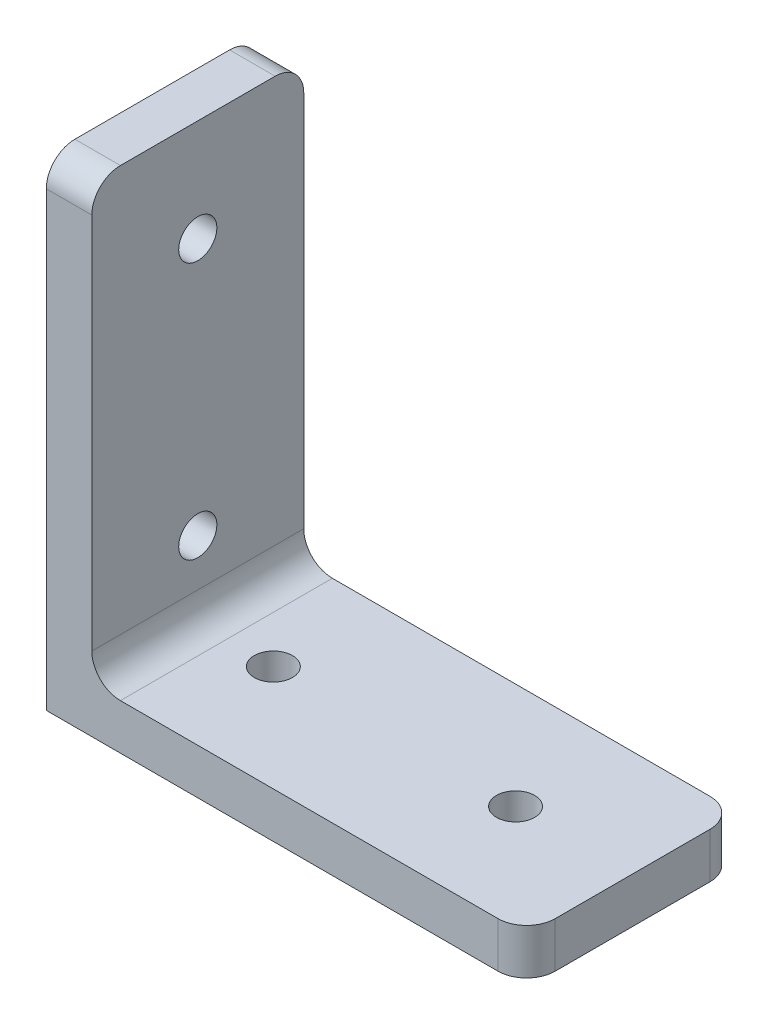
ISO-10303-21;
HEADER;
FILE_DESCRIPTION(('STEP AP214'),'2;1');
FILE_NAME('part.step','',(''),(''),'','','');
FILE_SCHEMA(('AUTOMOTIVE_DESIGN { 1 0 10303 214 1 1 1 1 }'));
ENDSEC;
DATA;
#1=APPLICATION_CONTEXT('core data for automotive mechanical design processes');
#2=APPLICATION_PROTOCOL_DEFINITION('international standard','automotive_design',2000,#1);
#3=PRODUCT_CONTEXT('',#1,'mechanical');
#4=PRODUCT('Part','Part','',(#3));
#5=PRODUCT_RELATED_PRODUCT_CATEGORY('part','',(#4));
#6=PRODUCT_DEFINITION_FORMATION('','',#4);
#7=PRODUCT_DEFINITION_CONTEXT('part definition',#1,'design');
#8=PRODUCT_DEFINITION('design','',#6,#7);
#9=PRODUCT_DEFINITION_SHAPE('','',#8);
#10=(LENGTH_UNIT() NAMED_UNIT(*) SI_UNIT(.MILLI.,.METRE.));
#11=(NAMED_UNIT(*) PLANE_ANGLE_UNIT() SI_UNIT($,.RADIAN.));
#12=(NAMED_UNIT(*) SI_UNIT($,.STERADIAN.) SOLID_ANGLE_UNIT());
#13=UNCERTAINTY_MEASURE_WITH_UNIT(LENGTH_MEASURE(1.E-05),#10,'distance_accuracy_value','');
#14=(GEOMETRIC_REPRESENTATION_CONTEXT(3) GLOBAL_UNCERTAINTY_ASSIGNED_CONTEXT((#13)) GLOBAL_UNIT_ASSIGNED_CONTEXT((#10,
#11,#12)) REPRESENTATION_CONTEXT('',''));
#15=CARTESIAN_POINT('',(0.,0.,0.));
#16=DIRECTION('',(0.,0.,1.));
#17=DIRECTION('',(1.,0.,0.));
#18=AXIS2_PLACEMENT_3D('',#15,#16,#17);
#19=CARTESIAN_POINT('',(4.77520000000008,39.6687,0.));
#20=DIRECTION('',(-1.,0.,0.));
#21=DIRECTION('',(0.,0.,1.));
#22=AXIS2_PLACEMENT_3D('',#19,#20,#21);
#23=CYLINDRICAL_SURFACE('',#22,2.);
#24=CARTESIAN_POINT('',(4.77520000000008,39.6687,0.));
#25=DIRECTION('',(-1.,0.,0.));
#26=DIRECTION('',(0.,0.,1.));
#27=AXIS2_PLACEMENT_3D('',#24,#25,#26);
#28=CIRCLE('',#27,2.);
#29=CARTESIAN_POINT('',(4.77520000000008,39.6687,2.));
#30=VERTEX_POINT('',#29);
#31=EDGE_CURVE('E149',#30,#30,#28,.T.);
#32=ORIENTED_EDGE('',*,*,#31,.F.);
#33=EDGE_LOOP('',(#32));
#34=FACE_BOUND('',#33,.T.);
#35=CARTESIAN_POINT('',(0.,39.6687,0.));
#36=DIRECTION('',(-1.,0.,0.));
#37=DIRECTION('',(0.,0.,1.));
#38=AXIS2_PLACEMENT_3D('',#35,#36,#37);
#39=CIRCLE('',#38,2.);
#40=CARTESIAN_POINT('',(0.,39.6687,2.));
#41=VERTEX_POINT('',#40);
#42=EDGE_CURVE('E116',#41,#41,#39,.T.);
#43=ORIENTED_EDGE('',*,*,#42,.T.);
#44=EDGE_LOOP('',(#43));
#45=FACE_BOUND('',#44,.T.);
#46=ADVANCED_FACE('F17',(#34,#45),#23,.F.);
#47=CARTESIAN_POINT('',(0.,12.7,0.));
#48=DIRECTION('',(-1.,0.,0.));
#49=DIRECTION('',(0.,0.,1.));
#50=AXIS2_PLACEMENT_3D('',#47,#48,#49);
#51=CYLINDRICAL_SURFACE('',#50,1.99999999999999);
#52=CARTESIAN_POINT('',(4.77520000000002,12.7,0.));
#53=DIRECTION('',(-1.,0.,0.));
#54=DIRECTION('',(0.,0.,1.));
#55=AXIS2_PLACEMENT_3D('',#52,#53,#54);
#56=CIRCLE('',#55,1.99999999999999);
#57=CARTESIAN_POINT('',(4.77520000000002,12.7,1.99999999999999));
#58=VERTEX_POINT('',#57);
#59=EDGE_CURVE('E20',#58,#58,#56,.T.);
#60=ORIENTED_EDGE('',*,*,#59,.F.);
#61=EDGE_LOOP('',(#60));
#62=FACE_BOUND('',#61,.T.);
#63=CARTESIAN_POINT('',(0.,12.7,0.));
#64=DIRECTION('',(-1.,0.,0.));
#65=DIRECTION('',(0.,0.,1.));
#66=AXIS2_PLACEMENT_3D('',#63,#64,#65);
#67=CIRCLE('',#66,1.99999999999999);
#68=CARTESIAN_POINT('',(0.,12.7,1.99999999999999));
#69=VERTEX_POINT('',#68);
#70=EDGE_CURVE('E178',#69,#69,#67,.T.);
#71=ORIENTED_EDGE('',*,*,#70,.T.);
#72=EDGE_LOOP('',(#71));
#73=FACE_BOUND('',#72,.T.);
#74=ADVANCED_FACE('F196',(#62,#73),#51,.F.);
#75=CARTESIAN_POINT('',(0.,47.3710902043135,-8.1125));
#76=DIRECTION('',(1.,0.,0.));
#77=DIRECTION('',(0.,0.,-1.));
#78=AXIS2_PLACEMENT_3D('',#75,#76,#77);
#79=CYLINDRICAL_SURFACE('',#78,3.);
#80=CARTESIAN_POINT('',(0.,47.3710902043135,-8.1125));
#81=DIRECTION('',(1.,0.,0.));
#82=DIRECTION('',(0.,0.,-1.));
#83=AXIS2_PLACEMENT_3D('',#80,#81,#82);
#84=CIRCLE('',#83,3.);
#85=CARTESIAN_POINT('',(0.,47.3710902043135,-11.1125));
#86=VERTEX_POINT('',#85);
#87=CARTESIAN_POINT('',(0.,50.3710902043135,-8.1125));
#88=VERTEX_POINT('',#87);
#89=EDGE_CURVE('E176',#86,#88,#84,.T.);
#90=ORIENTED_EDGE('',*,*,#89,.T.);
#91=DIRECTION('',(1.,0.,0.));
#92=VECTOR('',#91,1.);
#93=CARTESIAN_POINT('',(0.,50.3710902043135,-8.1125));
#94=LINE('',#93,#92);
#95=CARTESIAN_POINT('',(4.77520000000005,50.3710902043135,-8.1125));
#96=VERTEX_POINT('',#95);
#97=EDGE_CURVE('E99',#96,#88,#94,.F.);
#98=ORIENTED_EDGE('',*,*,#97,.F.);
#99=CARTESIAN_POINT('',(4.77520000000001,47.3710902043135,-8.1125));
#100=DIRECTION('',(1.,0.,0.));
#101=DIRECTION('',(0.,0.,-1.));
#102=AXIS2_PLACEMENT_3D('',#99,#100,#101);
#103=CIRCLE('',#102,3.);
#104=CARTESIAN_POINT('',(4.77520000000001,47.3710902043135,-11.1125));
#105=VERTEX_POINT('',#104);
#106=EDGE_CURVE('E93',#105,#96,#103,.T.);
#107=ORIENTED_EDGE('',*,*,#106,.F.);
#108=DIRECTION('',(1.,0.,0.));
#109=VECTOR('',#108,1.);
#110=CARTESIAN_POINT('',(46.0248,47.3710902043135,-11.1125));
#111=LINE('',#110,#109);
#112=EDGE_CURVE('E97',#105,#86,#111,.F.);
#113=ORIENTED_EDGE('',*,*,#112,.T.);
#114=EDGE_LOOP('',(#90,#98,#107,#113));
#115=FACE_BOUND('',#114,.T.);
#116=ADVANCED_FACE('F96',(#115),#79,.T.);
#117=CARTESIAN_POINT('',(0.,50.3710902043135,0.));
#118=DIRECTION('',(0.,1.,0.));
#119=DIRECTION('',(0.,0.,1.));
#120=AXIS2_PLACEMENT_3D('',#117,#118,#119);
#121=PLANE('',#120);
#122=DIRECTION('',(0.,0.,1.));
#123=VECTOR('',#122,1.);
#124=CARTESIAN_POINT('',(4.77520000000009,50.3710902043135,11.1125));
#125=LINE('',#124,#123);
#126=CARTESIAN_POINT('',(4.77520000000005,50.3710902043135,8.1125));
#127=VERTEX_POINT('',#126);
#128=EDGE_CURVE('E104',#96,#127,#125,.T.);
#129=ORIENTED_EDGE('',*,*,#128,.F.);
#130=ORIENTED_EDGE('',*,*,#97,.T.);
#131=DIRECTION('',(0.,0.,1.));
#132=VECTOR('',#131,1.);
#133=CARTESIAN_POINT('',(0.,50.3710902043135,11.1125));
#134=LINE('',#133,#132);
#135=CARTESIAN_POINT('',(0.,50.3710902043135,8.1125));
#136=VERTEX_POINT('',#135);
#137=EDGE_CURVE('E175',#88,#136,#134,.T.);
#138=ORIENTED_EDGE('',*,*,#137,.T.);
#139=DIRECTION('',(-1.,0.,0.));
#140=VECTOR('',#139,1.);
#141=CARTESIAN_POINT('',(46.0248,50.3710902043135,8.1125));
#142=LINE('',#141,#140);
#143=EDGE_CURVE('E141',#127,#136,#142,.T.);
#144=ORIENTED_EDGE('',*,*,#143,.F.);
#145=EDGE_LOOP('',(#129,#130,#138,#144));
#146=FACE_BOUND('',#145,.T.);
#147=ADVANCED_FACE('F261',(#146),#121,.T.);
#148=CARTESIAN_POINT('',(4.77520000000007,42.8204269072704,11.1125));
#149=DIRECTION('',(1.,0.,0.));
#150=DIRECTION('',(0.,1.,0.));
#151=AXIS2_PLACEMENT_3D('',#148,#149,#150);
#152=PLANE('',#151);
#153=DIRECTION('',(0.,1.,0.));
#154=VECTOR('',#153,1.);
#155=CARTESIAN_POINT('',(4.77520000000001,2.797247396956,-11.1125));
#156=LINE('',#155,#154);
#157=CARTESIAN_POINT('',(4.77520000000001,7.7752,-11.1125));
#158=VERTEX_POINT('',#157);
#159=EDGE_CURVE('E111',#158,#105,#156,.T.);
#160=ORIENTED_EDGE('',*,*,#159,.T.);
#161=ORIENTED_EDGE('',*,*,#106,.T.);
#162=ORIENTED_EDGE('',*,*,#128,.T.);
#163=CARTESIAN_POINT('',(4.77520000000001,47.3710902043135,8.1125));
#164=DIRECTION('',(-1.,0.,0.));
#165=DIRECTION('',(0.,0.,1.));
#166=AXIS2_PLACEMENT_3D('',#163,#164,#165);
#167=CIRCLE('',#166,3.);
#168=CARTESIAN_POINT('',(4.77520000000001,47.3710902043135,11.1125));
#169=VERTEX_POINT('',#168);
#170=EDGE_CURVE('E103',#169,#127,#167,.T.);
#171=ORIENTED_EDGE('',*,*,#170,.F.);
#172=DIRECTION('',(0.,1.,0.));
#173=VECTOR('',#172,1.);
#174=CARTESIAN_POINT('',(4.77520000000001,2.797247396956,11.1125));
#175=LINE('',#174,#173);
#176=CARTESIAN_POINT('',(4.77520000000001,7.7752,11.1125));
#177=VERTEX_POINT('',#176);
#178=EDGE_CURVE('E147',#177,#169,#175,.T.);
#179=ORIENTED_EDGE('',*,*,#178,.F.);
#180=DIRECTION('',(0.,0.,-1.));
#181=VECTOR('',#180,1.);
#182=CARTESIAN_POINT('',(4.77520000000001,7.7752,11.1125));
#183=LINE('',#182,#181);
#184=EDGE_CURVE('E121',#177,#158,#183,.T.);
#185=ORIENTED_EDGE('',*,*,#184,.T.);
#186=EDGE_LOOP('',(#160,#161,#162,#171,#179,#185));
#187=FACE_BOUND('',#186,.T.);
#188=ORIENTED_EDGE('',*,*,#31,.T.);
#189=EDGE_LOOP('',(#188));
#190=FACE_BOUND('',#189,.T.);
#191=ORIENTED_EDGE('',*,*,#59,.T.);
#192=EDGE_LOOP('',(#191));
#193=FACE_BOUND('',#192,.T.);
#194=ADVANCED_FACE('F118',(#187,#190,#193),#152,.T.);
#195=CARTESIAN_POINT('',(46.0248,47.3710902043135,8.1125));
#196=DIRECTION('',(-1.,0.,0.));
#197=DIRECTION('',(0.,0.,1.));
#198=AXIS2_PLACEMENT_3D('',#195,#196,#197);
#199=CYLINDRICAL_SURFACE('',#198,3.);
#200=CARTESIAN_POINT('',(0.,47.3710902043135,8.1125));
#201=DIRECTION('',(-1.,0.,0.));
#202=DIRECTION('',(0.,0.,1.));
#203=AXIS2_PLACEMENT_3D('',#200,#201,#202);
#204=CIRCLE('',#203,3.);
#205=CARTESIAN_POINT('',(0.,47.3710902043135,11.1125));
#206=VERTEX_POINT('',#205);
#207=EDGE_CURVE('E172',#136,#206,#204,.F.);
#208=ORIENTED_EDGE('',*,*,#207,.T.);
#209=DIRECTION('',(1.,0.,0.));
#210=VECTOR('',#209,1.);
#211=CARTESIAN_POINT('',(46.0248,47.3710902043135,11.1125));
#212=LINE('',#211,#210);
#213=EDGE_CURVE('E144',#169,#206,#212,.F.);
#214=ORIENTED_EDGE('',*,*,#213,.F.);
#215=ORIENTED_EDGE('',*,*,#170,.T.);
#216=ORIENTED_EDGE('',*,*,#143,.T.);
#217=EDGE_LOOP('',(#208,#214,#215,#216));
#218=FACE_BOUND('',#217,.T.);
#219=ADVANCED_FACE('F254',(#218),#199,.T.);
#220=CARTESIAN_POINT('',(7.77520000000001,7.7752,11.1125));
#221=DIRECTION('',(0.,0.,-1.));
#222=DIRECTION('',(-1.,0.,0.));
#223=AXIS2_PLACEMENT_3D('',#220,#221,#222);
#224=CYLINDRICAL_SURFACE('',#223,3.);
#225=ORIENTED_EDGE('',*,*,#184,.F.);
#226=CARTESIAN_POINT('',(7.77520000000001,7.7752,11.1125));
#227=DIRECTION('',(0.,0.,-1.));
#228=DIRECTION('',(-1.,0.,0.));
#229=AXIS2_PLACEMENT_3D('',#226,#227,#228);
#230=CIRCLE('',#229,3.);
#231=CARTESIAN_POINT('',(7.77520000000001,4.7752,11.1125));
#232=VERTEX_POINT('',#231);
#233=EDGE_CURVE('E168',#232,#177,#230,.T.);
#234=ORIENTED_EDGE('',*,*,#233,.F.);
#235=DIRECTION('',(0.,0.,1.));
#236=VECTOR('',#235,1.);
#237=CARTESIAN_POINT('',(7.77520000000001,4.7752,11.1125));
#238=LINE('',#237,#236);
#239=CARTESIAN_POINT('',(7.77520000000001,4.7752,-11.1125));
#240=VERTEX_POINT('',#239);
#241=EDGE_CURVE('E140',#240,#232,#238,.T.);
#242=ORIENTED_EDGE('',*,*,#241,.F.);
#243=CARTESIAN_POINT('',(7.77520000000001,7.7752,-11.1125));
#244=DIRECTION('',(0.,0.,-1.));
#245=DIRECTION('',(-1.,0.,0.));
#246=AXIS2_PLACEMENT_3D('',#243,#244,#245);
#247=CIRCLE('',#246,3.);
#248=EDGE_CURVE('E122',#240,#158,#247,.T.);
#249=ORIENTED_EDGE('',*,*,#248,.T.);
#250=EDGE_LOOP('',(#225,#234,#242,#249));
#251=FACE_BOUND('',#250,.T.);
#252=ADVANCED_FACE('F250',(#251),#224,.F.);
#253=CARTESIAN_POINT('',(5.28320000000001,4.7752,11.1125));
#254=DIRECTION('',(0.,1.,0.));
#255=DIRECTION('',(-1.,0.,0.));
#256=AXIS2_PLACEMENT_3D('',#253,#254,#255);
#257=PLANE('',#256);
#258=CARTESIAN_POINT('',(12.7,4.7752,0.));
#259=DIRECTION('',(0.,-1.,0.));
#260=DIRECTION('',(0.,0.,-1.));
#261=AXIS2_PLACEMENT_3D('',#258,#259,#260);
#262=CIRCLE('',#261,1.99999999999999);
#263=CARTESIAN_POINT('',(12.7,4.7752,-1.99999999999999));
#264=VERTEX_POINT('',#263);
#265=EDGE_CURVE('E143',#264,#264,#262,.T.);
#266=ORIENTED_EDGE('',*,*,#265,.T.);
#267=EDGE_LOOP('',(#266));
#268=FACE_BOUND('',#267,.T.);
#269=CARTESIAN_POINT('',(38.1,4.7752,0.));
#270=DIRECTION('',(0.,-1.,0.));
#271=DIRECTION('',(0.,0.,-1.));
#272=AXIS2_PLACEMENT_3D('',#269,#270,#271);
#273=CIRCLE('',#272,2.);
#274=CARTESIAN_POINT('',(38.1,4.7752,-2.));
#275=VERTEX_POINT('',#274);
#276=EDGE_CURVE('E184',#275,#275,#273,.T.);
#277=ORIENTED_EDGE('',*,*,#276,.T.);
#278=EDGE_LOOP('',(#277));
#279=FACE_BOUND('',#278,.T.);
#280=DIRECTION('',(1.,0.,0.));
#281=VECTOR('',#280,1.);
#282=CARTESIAN_POINT('',(46.0248,4.7752,-11.1125));
#283=LINE('',#282,#281);
#284=CARTESIAN_POINT('',(47.3710902043135,4.7752,-11.1125));
#285=VERTEX_POINT('',#284);
#286=EDGE_CURVE('E124',#285,#240,#283,.F.);
#287=ORIENTED_EDGE('',*,*,#286,.T.);
#288=ORIENTED_EDGE('',*,*,#241,.T.);
#289=DIRECTION('',(1.,0.,0.));
#290=VECTOR('',#289,1.);
#291=CARTESIAN_POINT('',(46.0248,4.7752,11.1125));
#292=LINE('',#291,#290);
#293=CARTESIAN_POINT('',(47.3710902043135,4.7752,11.1125));
#294=VERTEX_POINT('',#293);
#295=EDGE_CURVE('E171',#294,#232,#292,.F.);
#296=ORIENTED_EDGE('',*,*,#295,.F.);
#297=CARTESIAN_POINT('',(47.3710902043135,4.7752,8.1125));
#298=DIRECTION('',(0.,1.,0.));
#299=DIRECTION('',(0.,0.,1.));
#300=AXIS2_PLACEMENT_3D('',#297,#298,#299);
#301=CIRCLE('',#300,3.);
#302=CARTESIAN_POINT('',(50.3710902043135,4.7752,8.1125));
#303=VERTEX_POINT('',#302);
#304=EDGE_CURVE('E166',#303,#294,#301,.F.);
#305=ORIENTED_EDGE('',*,*,#304,.F.);
#306=DIRECTION('',(0.,0.,-1.));
#307=VECTOR('',#306,1.);
#308=CARTESIAN_POINT('',(50.3710902043135,4.7752,0.));
#309=LINE('',#308,#307);
#310=CARTESIAN_POINT('',(50.3710902043135,4.7752,-8.1125));
#311=VERTEX_POINT('',#310);
#312=EDGE_CURVE('E136',#311,#303,#309,.F.);
#313=ORIENTED_EDGE('',*,*,#312,.F.);
#314=CARTESIAN_POINT('',(47.3710902043135,4.7752,-8.1125));
#315=DIRECTION('',(0.,-1.,0.));
#316=DIRECTION('',(0.,0.,-1.));
#317=AXIS2_PLACEMENT_3D('',#314,#315,#316);
#318=CIRCLE('',#317,3.);
#319=EDGE_CURVE('E135',#285,#311,#318,.T.);
#320=ORIENTED_EDGE('',*,*,#319,.F.);
#321=EDGE_LOOP('',(#287,#288,#296,#305,#313,#320));
#322=FACE_BOUND('',#321,.T.);
#323=ADVANCED_FACE('F246',(#268,#279,#322),#257,.T.);
#324=CARTESIAN_POINT('',(12.7,0.,0.));
#325=DIRECTION('',(0.,-1.,0.));
#326=DIRECTION('',(0.,0.,-1.));
#327=AXIS2_PLACEMENT_3D('',#324,#325,#326);
#328=CYLINDRICAL_SURFACE('',#327,1.99999999999999);
#329=ORIENTED_EDGE('',*,*,#265,.F.);
#330=EDGE_LOOP('',(#329));
#331=FACE_BOUND('',#330,.T.);
#332=CARTESIAN_POINT('',(12.7,0.,0.));
#333=DIRECTION('',(0.,-1.,0.));
#334=DIRECTION('',(0.,0.,-1.));
#335=AXIS2_PLACEMENT_3D('',#332,#333,#334);
#336=CIRCLE('',#335,1.99999999999999);
#337=CARTESIAN_POINT('',(12.7,0.,-1.99999999999999));
#338=VERTEX_POINT('',#337);
#339=EDGE_CURVE('E162',#338,#338,#336,.T.);
#340=ORIENTED_EDGE('',*,*,#339,.T.);
#341=EDGE_LOOP('',(#340));
#342=FACE_BOUND('',#341,.T.);
#343=ADVANCED_FACE('F242',(#331,#342),#328,.F.);
#344=CARTESIAN_POINT('',(38.1,4.7752,0.));
#345=DIRECTION('',(0.,-1.,0.));
#346=DIRECTION('',(0.,0.,-1.));
#347=AXIS2_PLACEMENT_3D('',#344,#345,#346);
#348=CYLINDRICAL_SURFACE('',#347,2.);
#349=ORIENTED_EDGE('',*,*,#276,.F.);
#350=EDGE_LOOP('',(#349));
#351=FACE_BOUND('',#350,.T.);
#352=CARTESIAN_POINT('',(38.1,0.,0.));
#353=DIRECTION('',(0.,-1.,0.));
#354=DIRECTION('',(0.,0.,-1.));
#355=AXIS2_PLACEMENT_3D('',#352,#353,#354);
#356=CIRCLE('',#355,2.);
#357=CARTESIAN_POINT('',(38.1,0.,-2.));
#358=VERTEX_POINT('',#357);
#359=EDGE_CURVE('E159',#358,#358,#356,.T.);
#360=ORIENTED_EDGE('',*,*,#359,.T.);
#361=EDGE_LOOP('',(#360));
#362=FACE_BOUND('',#361,.T.);
#363=ADVANCED_FACE('F238',(#351,#362),#348,.F.);
#364=CARTESIAN_POINT('',(47.3710902043135,0.,-8.1125));
#365=DIRECTION('',(0.,-1.,0.));
#366=DIRECTION('',(0.,0.,-1.));
#367=AXIS2_PLACEMENT_3D('',#364,#365,#366);
#368=CYLINDRICAL_SURFACE('',#367,3.);
#369=ORIENTED_EDGE('',*,*,#319,.T.);
#370=DIRECTION('',(0.,1.,0.));
#371=VECTOR('',#370,1.);
#372=CARTESIAN_POINT('',(50.3710902043135,0.,-8.1125));
#373=LINE('',#372,#371);
#374=CARTESIAN_POINT('',(50.3710902043135,0.,-8.1125));
#375=VERTEX_POINT('',#374);
#376=EDGE_CURVE('E165',#375,#311,#373,.T.);
#377=ORIENTED_EDGE('',*,*,#376,.F.);
#378=CARTESIAN_POINT('',(47.3710902043135,0.,-8.1125));
#379=DIRECTION('',(0.,-1.,0.));
#380=DIRECTION('',(0.,0.,-1.));
#381=AXIS2_PLACEMENT_3D('',#378,#379,#380);
#382=CIRCLE('',#381,3.);
#383=CARTESIAN_POINT('',(47.3710902043135,0.,-11.1125));
#384=VERTEX_POINT('',#383);
#385=EDGE_CURVE('E155',#375,#384,#382,.F.);
#386=ORIENTED_EDGE('',*,*,#385,.T.);
#387=DIRECTION('',(0.,1.,0.));
#388=VECTOR('',#387,1.);
#389=CARTESIAN_POINT('',(47.3710902043135,2.797247396956,-11.1125));
#390=LINE('',#389,#388);
#391=EDGE_CURVE('E132',#384,#285,#390,.T.);
#392=ORIENTED_EDGE('',*,*,#391,.T.);
#393=EDGE_LOOP('',(#369,#377,#386,#392));
#394=FACE_BOUND('',#393,.T.);
#395=ADVANCED_FACE('F235',(#394),#368,.T.);
#396=CARTESIAN_POINT('',(46.0248,2.797247396956,-11.1125));
#397=DIRECTION('',(0.,0.,1.));
#398=DIRECTION('',(1.,0.,0.));
#399=AXIS2_PLACEMENT_3D('',#396,#397,#398);
#400=PLANE('',#399);
#401=ORIENTED_EDGE('',*,*,#112,.F.);
#402=ORIENTED_EDGE('',*,*,#159,.F.);
#403=ORIENTED_EDGE('',*,*,#248,.F.);
#404=ORIENTED_EDGE('',*,*,#286,.F.);
#405=ORIENTED_EDGE('',*,*,#391,.F.);
#406=DIRECTION('',(1.,0.,0.));
#407=VECTOR('',#406,1.);
#408=CARTESIAN_POINT('',(0.,0.,-11.1125));
#409=LINE('',#408,#407);
#410=CARTESIAN_POINT('',(0.,0.,-11.1125));
#411=VERTEX_POINT('',#410);
#412=EDGE_CURVE('E158',#384,#411,#409,.F.);
#413=ORIENTED_EDGE('',*,*,#412,.T.);
#414=DIRECTION('',(0.,1.,0.));
#415=VECTOR('',#414,1.);
#416=CARTESIAN_POINT('',(0.,50.8,-11.1125));
#417=LINE('',#416,#415);
#418=EDGE_CURVE('E115',#411,#86,#417,.T.);
#419=ORIENTED_EDGE('',*,*,#418,.T.);
#420=EDGE_LOOP('',(#401,#402,#403,#404,#405,#413,#419));
#421=FACE_BOUND('',#420,.T.);
#422=ADVANCED_FACE('F109',(#421),#400,.F.);
#423=CARTESIAN_POINT('',(0.,50.8,11.1125));
#424=DIRECTION('',(1.,0.,0.));
#425=DIRECTION('',(0.,1.,0.));
#426=AXIS2_PLACEMENT_3D('',#423,#424,#425);
#427=PLANE('',#426);
#428=ORIENTED_EDGE('',*,*,#207,.F.);
#429=ORIENTED_EDGE('',*,*,#137,.F.);
#430=ORIENTED_EDGE('',*,*,#89,.F.);
#431=ORIENTED_EDGE('',*,*,#418,.F.);
#432=DIRECTION('',(0.,0.,1.));
#433=VECTOR('',#432,1.);
#434=CARTESIAN_POINT('',(0.,0.,11.1125));
#435=LINE('',#434,#433);
#436=CARTESIAN_POINT('',(0.,0.,11.1125));
#437=VERTEX_POINT('',#436);
#438=EDGE_CURVE('E390',#411,#437,#435,.T.);
#439=ORIENTED_EDGE('',*,*,#438,.T.);
#440=DIRECTION('',(0.,1.,0.));
#441=VECTOR('',#440,1.);
#442=CARTESIAN_POINT('',(0.,2.797247396956,11.1125));
#443=LINE('',#442,#441);
#444=EDGE_CURVE('E146',#206,#437,#443,.F.);
#445=ORIENTED_EDGE('',*,*,#444,.F.);
#446=EDGE_LOOP('',(#428,#429,#430,#431,#439,#445));
#447=FACE_BOUND('',#446,.T.);
#448=ORIENTED_EDGE('',*,*,#70,.F.);
#449=EDGE_LOOP('',(#448));
#450=FACE_BOUND('',#449,.T.);
#451=ORIENTED_EDGE('',*,*,#42,.F.);
#452=EDGE_LOOP('',(#451));
#453=FACE_BOUND('',#452,.T.);
#454=ADVANCED_FACE('F201',(#447,#450,#453),#427,.F.);
#455=CARTESIAN_POINT('',(46.0248,2.797247396956,11.1125));
#456=DIRECTION('',(0.,0.,1.));
#457=DIRECTION('',(1.,0.,0.));
#458=AXIS2_PLACEMENT_3D('',#455,#456,#457);
#459=PLANE('',#458);
#460=ORIENTED_EDGE('',*,*,#295,.T.);
#461=ORIENTED_EDGE('',*,*,#233,.T.);
#462=ORIENTED_EDGE('',*,*,#178,.T.);
#463=ORIENTED_EDGE('',*,*,#213,.T.);
#464=ORIENTED_EDGE('',*,*,#444,.T.);
#465=DIRECTION('',(1.,0.,0.));
#466=VECTOR('',#465,1.);
#467=CARTESIAN_POINT('',(0.,0.,11.1125));
#468=LINE('',#467,#466);
#469=CARTESIAN_POINT('',(47.3710902043135,0.,11.1125));
#470=VERTEX_POINT('',#469);
#471=EDGE_CURVE('E154',#437,#470,#468,.T.);
#472=ORIENTED_EDGE('',*,*,#471,.T.);
#473=DIRECTION('',(0.,1.,0.));
#474=VECTOR('',#473,1.);
#475=CARTESIAN_POINT('',(47.3710902043135,2.797247396956,11.1125));
#476=LINE('',#475,#474);
#477=EDGE_CURVE('E138',#294,#470,#476,.F.);
#478=ORIENTED_EDGE('',*,*,#477,.F.);
#479=EDGE_LOOP('',(#460,#461,#462,#463,#464,#472,#478));
#480=FACE_BOUND('',#479,.T.);
#481=ADVANCED_FACE('F204',(#480),#459,.T.);
#482=CARTESIAN_POINT('',(47.3710902043135,2.797247396956,8.1125));
#483=DIRECTION('',(0.,1.,0.));
#484=DIRECTION('',(0.,0.,1.));
#485=AXIS2_PLACEMENT_3D('',#482,#483,#484);
#486=CYLINDRICAL_SURFACE('',#485,3.);
#487=ORIENTED_EDGE('',*,*,#304,.T.);
#488=ORIENTED_EDGE('',*,*,#477,.T.);
#489=CARTESIAN_POINT('',(47.3710902043135,0.,8.1125));
#490=DIRECTION('',(0.,1.,0.));
#491=DIRECTION('',(0.,0.,1.));
#492=AXIS2_PLACEMENT_3D('',#489,#490,#491);
#493=CIRCLE('',#492,3.);
#494=CARTESIAN_POINT('',(50.3710902043135,0.,8.1125));
#495=VERTEX_POINT('',#494);
#496=EDGE_CURVE('E26',#470,#495,#493,.T.);
#497=ORIENTED_EDGE('',*,*,#496,.T.);
#498=DIRECTION('',(0.,1.,0.));
#499=VECTOR('',#498,1.);
#500=CARTESIAN_POINT('',(50.3710902043135,0.,8.1125));
#501=LINE('',#500,#499);
#502=EDGE_CURVE('E34',#303,#495,#501,.F.);
#503=ORIENTED_EDGE('',*,*,#502,.F.);
#504=EDGE_LOOP('',(#487,#488,#497,#503));
#505=FACE_BOUND('',#504,.T.);
#506=ADVANCED_FACE('F222',(#505),#486,.T.);
#507=CARTESIAN_POINT('',(50.3710902043135,0.,0.));
#508=DIRECTION('',(1.,0.,0.));
#509=DIRECTION('',(0.,0.,-1.));
#510=AXIS2_PLACEMENT_3D('',#507,#508,#509);
#511=PLANE('',#510);
#512=DIRECTION('',(0.,0.,1.));
#513=VECTOR('',#512,1.);
#514=CARTESIAN_POINT('',(50.3710902043135,0.,11.1125));
#515=LINE('',#514,#513);
#516=EDGE_CURVE('E11',#495,#375,#515,.F.);
#517=ORIENTED_EDGE('',*,*,#516,.T.);
#518=ORIENTED_EDGE('',*,*,#376,.T.);
#519=ORIENTED_EDGE('',*,*,#312,.T.);
#520=ORIENTED_EDGE('',*,*,#502,.T.);
#521=EDGE_LOOP('',(#517,#518,#519,#520));
#522=FACE_BOUND('',#521,.T.);
#523=ADVANCED_FACE('F216',(#522),#511,.T.);
#524=CARTESIAN_POINT('',(0.,0.,11.1125));
#525=DIRECTION('',(0.,1.,0.));
#526=DIRECTION('',(0.,0.,1.));
#527=AXIS2_PLACEMENT_3D('',#524,#525,#526);
#528=PLANE('',#527);
#529=ORIENTED_EDGE('',*,*,#496,.F.);
#530=ORIENTED_EDGE('',*,*,#471,.F.);
#531=ORIENTED_EDGE('',*,*,#438,.F.);
#532=ORIENTED_EDGE('',*,*,#412,.F.);
#533=ORIENTED_EDGE('',*,*,#385,.F.);
#534=ORIENTED_EDGE('',*,*,#516,.F.);
#535=EDGE_LOOP('',(#529,#530,#531,#532,#533,#534));
#536=FACE_BOUND('',#535,.T.);
#537=ORIENTED_EDGE('',*,*,#359,.F.);
#538=EDGE_LOOP('',(#537));
#539=FACE_BOUND('',#538,.T.);
#540=ORIENTED_EDGE('',*,*,#339,.F.);
#541=EDGE_LOOP('',(#540));
#542=FACE_BOUND('',#541,.T.);
#543=ADVANCED_FACE('F214',(#536,#539,#542),#528,.F.);
#544=CLOSED_SHELL('',(#46,#74,#116,#147,#194,#219,#252,#323,#343,#363,#395,#422,#454,#481,#506,
#523,#543));
#545=MANIFOLD_SOLID_BREP('B1',#544);
#546=ADVANCED_BREP_SHAPE_REPRESENTATION('',(#18,#545),#14);
#547=SHAPE_DEFINITION_REPRESENTATION(#9,#546);
ENDSEC;
END-ISO-10303-21;
